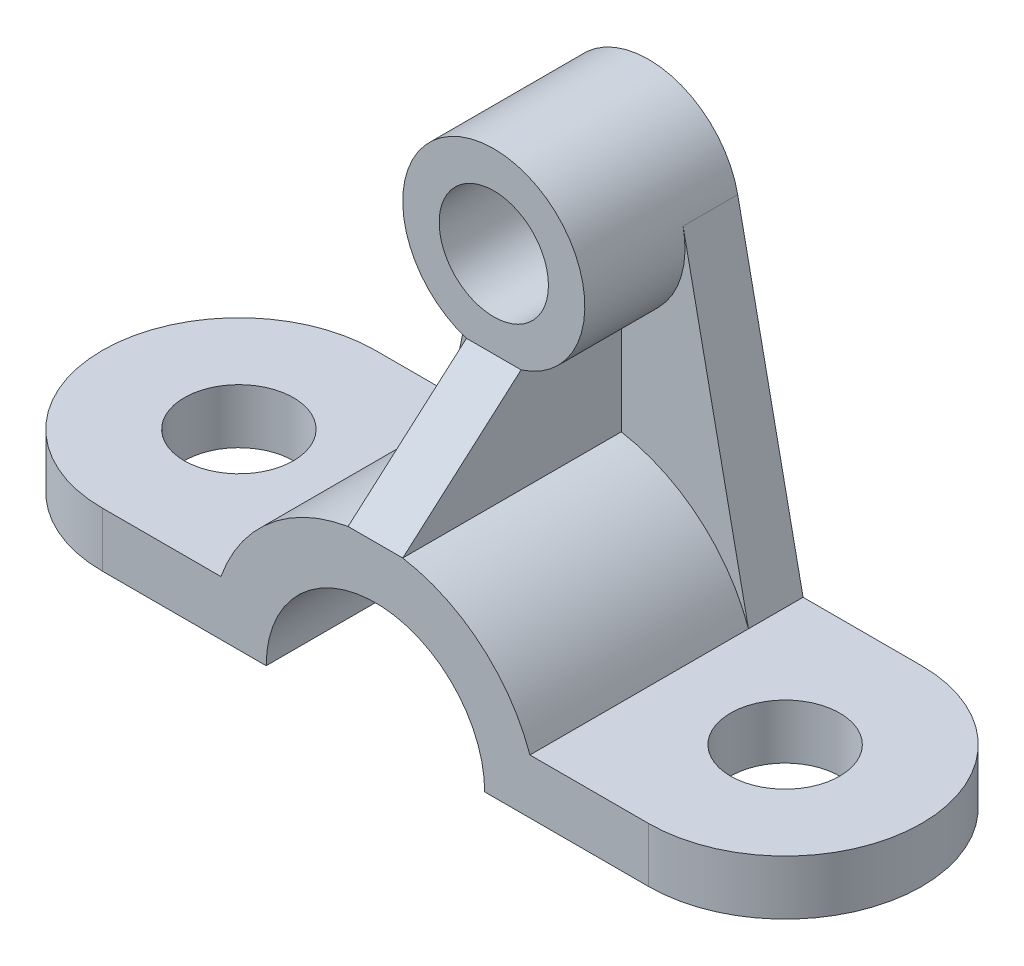
ISO-10303-21;
HEADER;
FILE_DESCRIPTION(('STEP AP214'),'2;1');
FILE_NAME('part.step','',(''),(''),'','','');
FILE_SCHEMA(('AUTOMOTIVE_DESIGN { 1 0 10303 214 1 1 1 1 }'));
ENDSEC;
DATA;
#1=APPLICATION_CONTEXT('core data for automotive mechanical design processes');
#2=APPLICATION_PROTOCOL_DEFINITION('international standard','automotive_design',2000,#1);
#3=PRODUCT_CONTEXT('',#1,'mechanical');
#4=PRODUCT('Part','Part','',(#3));
#5=PRODUCT_RELATED_PRODUCT_CATEGORY('part','',(#4));
#6=PRODUCT_DEFINITION_FORMATION('','',#4);
#7=PRODUCT_DEFINITION_CONTEXT('part definition',#1,'design');
#8=PRODUCT_DEFINITION('design','',#6,#7);
#9=PRODUCT_DEFINITION_SHAPE('','',#8);
#10=(LENGTH_UNIT() NAMED_UNIT(*) SI_UNIT(.MILLI.,.METRE.));
#11=(NAMED_UNIT(*) PLANE_ANGLE_UNIT() SI_UNIT($,.RADIAN.));
#12=(NAMED_UNIT(*) SI_UNIT($,.STERADIAN.) SOLID_ANGLE_UNIT());
#13=UNCERTAINTY_MEASURE_WITH_UNIT(LENGTH_MEASURE(1.E-05),#10,'distance_accuracy_value','');
#14=(GEOMETRIC_REPRESENTATION_CONTEXT(3) GLOBAL_UNCERTAINTY_ASSIGNED_CONTEXT((#13)) GLOBAL_UNIT_ASSIGNED_CONTEXT((#10,
#11,#12)) REPRESENTATION_CONTEXT('',''));
#15=CARTESIAN_POINT('',(0.,0.,0.));
#16=DIRECTION('',(0.,0.,1.));
#17=DIRECTION('',(1.,0.,0.));
#18=AXIS2_PLACEMENT_3D('',#15,#16,#17);
#19=CARTESIAN_POINT('',(-102.970359754415,18.3988084707033,60.));
#20=DIRECTION('',(0.,1.,0.));
#21=DIRECTION('',(-1.,0.,0.));
#22=AXIS2_PLACEMENT_3D('',#19,#20,#21);
#23=PLANE('',#22);
#24=CARTESIAN_POINT('',(-138.970359754415,18.3988084707033,30.));
#25=DIRECTION('',(0.,1.,0.));
#26=DIRECTION('',(0.,0.,1.));
#27=AXIS2_PLACEMENT_3D('',#24,#25,#26);
#28=CIRCLE('',#27,12.);
#29=CARTESIAN_POINT('',(-138.970359754415,18.3988084707033,42.));
#30=VERTEX_POINT('',#29);
#31=EDGE_CURVE('E286',#30,#30,#28,.T.);
#32=ORIENTED_EDGE('',*,*,#31,.T.);
#33=EDGE_LOOP('',(#32));
#34=FACE_BOUND('',#33,.T.);
#35=DIRECTION('',(1.,0.,0.));
#36=VECTOR('',#35,1.);
#37=CARTESIAN_POINT('',(-54.9703597544148,18.3988084707033,0.));
#38=LINE('',#37,#36);
#39=CARTESIAN_POINT('',(-138.970359754415,18.3988084707033,0.));
#40=VERTEX_POINT('',#39);
#41=CARTESIAN_POINT('',(-102.970359754415,18.3988084707033,0.));
#42=VERTEX_POINT('',#41);
#43=EDGE_CURVE('E185',#40,#42,#38,.T.);
#44=ORIENTED_EDGE('',*,*,#43,.T.);
#45=DIRECTION('',(0.,0.,-1.));
#46=VECTOR('',#45,1.);
#47=CARTESIAN_POINT('',(-102.970359754415,18.3988084707033,60.));
#48=LINE('',#47,#46);
#49=CARTESIAN_POINT('',(-102.970359754415,18.3988084707033,60.));
#50=VERTEX_POINT('',#49);
#51=EDGE_CURVE('E174',#50,#42,#48,.T.);
#52=ORIENTED_EDGE('',*,*,#51,.F.);
#53=DIRECTION('',(1.,0.,0.));
#54=VECTOR('',#53,1.);
#55=CARTESIAN_POINT('',(-102.970359754415,18.3988084707033,60.));
#56=LINE('',#55,#54);
#57=CARTESIAN_POINT('',(-138.970359754415,18.3988084707033,60.));
#58=VERTEX_POINT('',#57);
#59=EDGE_CURVE('E196',#58,#50,#56,.T.);
#60=ORIENTED_EDGE('',*,*,#59,.F.);
#61=CARTESIAN_POINT('',(-138.970359754415,18.3988084707033,30.));
#62=DIRECTION('',(0.,1.,0.));
#63=DIRECTION('',(-1.,0.,0.));
#64=AXIS2_PLACEMENT_3D('',#61,#62,#63);
#65=CIRCLE('',#64,30.);
#66=EDGE_CURVE('E222',#58,#40,#65,.F.);
#67=ORIENTED_EDGE('',*,*,#66,.T.);
#68=EDGE_LOOP('',(#44,#52,#60,#67));
#69=FACE_BOUND('',#68,.T.);
#70=ADVANCED_FACE('F48',(#34,#69),#23,.F.);
#71=CARTESIAN_POINT('',(-78.9703597544148,18.3988084707033,60.));
#72=DIRECTION('',(0.,0.,-1.));
#73=DIRECTION('',(-1.,0.,0.));
#74=AXIS2_PLACEMENT_3D('',#71,#72,#73);
#75=CYLINDRICAL_SURFACE('',#74,36.);
#76=DIRECTION('',(0.,0.,-1.));
#77=VECTOR('',#76,1.);
#78=CARTESIAN_POINT('',(-84.9703597544148,53.895287169301,60.));
#79=LINE('',#78,#77);
#80=CARTESIAN_POINT('',(-84.9703597544148,53.895287169301,12.));
#81=VERTEX_POINT('',#80);
#82=CARTESIAN_POINT('',(-84.9703597544148,53.895287169301,60.));
#83=VERTEX_POINT('',#82);
#84=EDGE_CURVE('E350',#81,#83,#79,.F.);
#85=ORIENTED_EDGE('',*,*,#84,.F.);
#86=CARTESIAN_POINT('',(-78.9703597544148,18.3988084707033,12.));
#87=DIRECTION('',(0.,0.,-1.));
#88=DIRECTION('',(-1.,0.,0.));
#89=AXIS2_PLACEMENT_3D('',#86,#87,#88);
#90=CIRCLE('',#89,36.);
#91=CARTESIAN_POINT('',(-112.911485251369,30.3988084707033,12.));
#92=VERTEX_POINT('',#91);
#93=EDGE_CURVE('E283',#92,#81,#90,.T.);
#94=ORIENTED_EDGE('',*,*,#93,.F.);
#95=DIRECTION('',(0.,0.,-1.));
#96=VECTOR('',#95,1.);
#97=CARTESIAN_POINT('',(-112.911485251369,30.3988084707033,60.));
#98=LINE('',#97,#96);
#99=CARTESIAN_POINT('',(-112.911485251369,30.3988084707033,60.));
#100=VERTEX_POINT('',#99);
#101=EDGE_CURVE('E208',#100,#92,#98,.T.);
#102=ORIENTED_EDGE('',*,*,#101,.F.);
#103=CARTESIAN_POINT('',(-78.9703597544148,18.3988084707033,60.));
#104=DIRECTION('',(0.,0.,1.));
#105=DIRECTION('',(1.,0.,0.));
#106=AXIS2_PLACEMENT_3D('',#103,#104,#105);
#107=CIRCLE('',#106,36.);
#108=EDGE_CURVE('E305',#83,#100,#107,.T.);
#109=ORIENTED_EDGE('',*,*,#108,.F.);
#110=EDGE_LOOP('',(#85,#94,#102,#109));
#111=FACE_BOUND('',#110,.T.);
#112=ADVANCED_FACE('F391',(#111),#75,.T.);
#113=DIRECTION('',(0.,0.,-1.));
#114=VECTOR('',#113,1.);
#115=CARTESIAN_POINT('',(-72.9703597544148,53.895287169301,60.));
#116=LINE('',#115,#114);
#117=CARTESIAN_POINT('',(-72.9703597544148,53.895287169301,60.));
#118=VERTEX_POINT('',#117);
#119=CARTESIAN_POINT('',(-72.9703597544148,53.895287169301,12.));
#120=VERTEX_POINT('',#119);
#121=EDGE_CURVE('E360',#118,#120,#116,.T.);
#122=ORIENTED_EDGE('',*,*,#121,.F.);
#123=CARTESIAN_POINT('',(-45.0292342574605,30.3988084707033,60.));
#124=VERTEX_POINT('',#123);
#125=EDGE_CURVE('E306',#124,#118,#107,.T.);
#126=ORIENTED_EDGE('',*,*,#125,.F.);
#127=DIRECTION('',(0.,0.,-1.));
#128=VECTOR('',#127,1.);
#129=CARTESIAN_POINT('',(-45.0292342574605,30.3988084707033,60.));
#130=LINE('',#129,#128);
#131=CARTESIAN_POINT('',(-45.0292342574605,30.3988084707033,12.));
#132=VERTEX_POINT('',#131);
#133=EDGE_CURVE('E168',#124,#132,#130,.T.);
#134=ORIENTED_EDGE('',*,*,#133,.T.);
#135=EDGE_CURVE('E261',#120,#132,#90,.T.);
#136=ORIENTED_EDGE('',*,*,#135,.F.);
#137=EDGE_LOOP('',(#122,#126,#134,#136));
#138=FACE_BOUND('',#137,.T.);
#139=ADVANCED_FACE('F402',(#138),#75,.T.);
#140=CARTESIAN_POINT('',(-78.9703597544148,95.7719290577585,12.));
#141=DIRECTION('',(0.,0.,-1.));
#142=DIRECTION('',(-1.,0.,0.));
#143=AXIS2_PLACEMENT_3D('',#140,#141,#142);
#144=CYLINDRICAL_SURFACE('',#143,20.);
#145=CARTESIAN_POINT('',(-78.9703597544148,95.7719290577585,12.));
#146=DIRECTION('',(0.,0.,-1.));
#147=DIRECTION('',(-1.,0.,0.));
#148=AXIS2_PLACEMENT_3D('',#145,#146,#147);
#149=CIRCLE('',#148,20.);
#150=CARTESIAN_POINT('',(-98.5560115632565,99.8218973567473,12.));
#151=VERTEX_POINT('',#150);
#152=CARTESIAN_POINT('',(-84.9703597544148,76.6931450294196,12.));
#153=VERTEX_POINT('',#152);
#154=EDGE_CURVE('E58',#151,#153,#149,.F.);
#155=ORIENTED_EDGE('',*,*,#154,.T.);
#156=DIRECTION('',(0.,0.,-1.));
#157=VECTOR('',#156,1.);
#158=CARTESIAN_POINT('',(-84.9703597544148,76.6931450294196,12.));
#159=LINE('',#158,#157);
#160=CARTESIAN_POINT('',(-84.9703597544148,76.6931450294196,34.));
#161=VERTEX_POINT('',#160);
#162=EDGE_CURVE('E357',#153,#161,#159,.F.);
#163=ORIENTED_EDGE('',*,*,#162,.T.);
#164=CARTESIAN_POINT('',(-78.9703597544148,95.7719290577585,34.));
#165=DIRECTION('',(0.,0.,1.));
#166=DIRECTION('',(1.,0.,0.));
#167=AXIS2_PLACEMENT_3D('',#164,#165,#166);
#168=CIRCLE('',#167,20.);
#169=CARTESIAN_POINT('',(-72.9703597544148,76.6931450294196,34.));
#170=VERTEX_POINT('',#169);
#171=EDGE_CURVE('E341',#170,#161,#168,.T.);
#172=ORIENTED_EDGE('',*,*,#171,.F.);
#173=DIRECTION('',(0.,0.,-1.));
#174=VECTOR('',#173,1.);
#175=CARTESIAN_POINT('',(-72.9703597544148,76.6931450294196,12.));
#176=LINE('',#175,#174);
#177=CARTESIAN_POINT('',(-72.9703597544148,76.6931450294196,12.));
#178=VERTEX_POINT('',#177);
#179=EDGE_CURVE('E254',#170,#178,#176,.T.);
#180=ORIENTED_EDGE('',*,*,#179,.T.);
#181=CARTESIAN_POINT('',(-59.384707945573,99.8218973567473,12.));
#182=VERTEX_POINT('',#181);
#183=EDGE_CURVE('E237',#178,#182,#149,.F.);
#184=ORIENTED_EDGE('',*,*,#183,.T.);
#185=DIRECTION('',(0.,0.,-1.));
#186=VECTOR('',#185,1.);
#187=CARTESIAN_POINT('',(-59.384707945573,99.8218973567473,12.));
#188=LINE('',#187,#186);
#189=CARTESIAN_POINT('',(-59.384707945573,99.8218973567473,0.));
#190=VERTEX_POINT('',#189);
#191=EDGE_CURVE('E250',#182,#190,#188,.T.);
#192=ORIENTED_EDGE('',*,*,#191,.T.);
#193=CARTESIAN_POINT('',(-78.9703597544148,95.7719290577585,0.));
#194=DIRECTION('',(0.,0.,-1.));
#195=DIRECTION('',(-1.,0.,0.));
#196=AXIS2_PLACEMENT_3D('',#193,#194,#195);
#197=CIRCLE('',#196,20.);
#198=CARTESIAN_POINT('',(-98.5560115632565,99.8218973567473,0.));
#199=VERTEX_POINT('',#198);
#200=EDGE_CURVE('E339',#199,#190,#197,.T.);
#201=ORIENTED_EDGE('',*,*,#200,.F.);
#202=DIRECTION('',(0.,0.,-1.));
#203=VECTOR('',#202,1.);
#204=CARTESIAN_POINT('',(-98.5560115632565,99.8218973567473,12.));
#205=LINE('',#204,#203);
#206=EDGE_CURVE('E331',#151,#199,#205,.T.);
#207=ORIENTED_EDGE('',*,*,#206,.F.);
#208=EDGE_LOOP('',(#155,#163,#172,#180,#184,#192,#201,#207));
#209=FACE_BOUND('',#208,.T.);
#210=ADVANCED_FACE('F247',(#209),#144,.T.);
#211=CARTESIAN_POINT('',(-78.9703597544148,95.7719290577585,12.));
#212=DIRECTION('',(0.,0.,-1.));
#213=DIRECTION('',(-1.,0.,0.));
#214=AXIS2_PLACEMENT_3D('',#211,#212,#213);
#215=PLANE('',#214);
#216=DIRECTION('',(0.,-1.,0.));
#217=VECTOR('',#216,1.);
#218=CARTESIAN_POINT('',(-84.9703597544148,79.2239690090847,12.));
#219=LINE('',#218,#217);
#220=EDGE_CURVE('E368',#153,#81,#219,.T.);
#221=ORIENTED_EDGE('',*,*,#220,.F.);
#222=ORIENTED_EDGE('',*,*,#154,.F.);
#223=DIRECTION('',(0.202498414949441,0.979282590442087,0.));
#224=VECTOR('',#223,1.);
#225=CARTESIAN_POINT('',(-98.5560115632565,99.8218973567473,12.));
#226=LINE('',#225,#224);
#227=EDGE_CURVE('E265',#92,#151,#226,.T.);
#228=ORIENTED_EDGE('',*,*,#227,.F.);
#229=ORIENTED_EDGE('',*,*,#93,.T.);
#230=EDGE_LOOP('',(#221,#222,#228,#229));
#231=FACE_BOUND('',#230,.T.);
#232=ADVANCED_FACE('F394',(#231),#215,.F.);
#233=DIRECTION('',(0.,1.,0.));
#234=VECTOR('',#233,1.);
#235=CARTESIAN_POINT('',(-72.9703597544148,79.2239690090847,12.));
#236=LINE('',#235,#234);
#237=EDGE_CURVE('E365',#120,#178,#236,.T.);
#238=ORIENTED_EDGE('',*,*,#237,.F.);
#239=ORIENTED_EDGE('',*,*,#135,.T.);
#240=DIRECTION('',(0.202498414949441,-0.979282590442087,0.));
#241=VECTOR('',#240,1.);
#242=CARTESIAN_POINT('',(-59.384707945573,99.8218973567473,12.));
#243=LINE('',#242,#241);
#244=EDGE_CURVE('E258',#182,#132,#243,.T.);
#245=ORIENTED_EDGE('',*,*,#244,.F.);
#246=ORIENTED_EDGE('',*,*,#183,.F.);
#247=EDGE_LOOP('',(#238,#239,#245,#246));
#248=FACE_BOUND('',#247,.T.);
#249=ADVANCED_FACE('F259',(#248),#215,.F.);
#250=CARTESIAN_POINT('',(-78.9703597544148,95.7719290577585,34.));
#251=DIRECTION('',(0.,0.,1.));
#252=DIRECTION('',(1.,0.,0.));
#253=AXIS2_PLACEMENT_3D('',#250,#251,#252);
#254=PLANE('',#253);
#255=ORIENTED_EDGE('',*,*,#171,.T.);
#256=DIRECTION('',(-1.,0.,0.));
#257=VECTOR('',#256,1.);
#258=CARTESIAN_POINT('',(11.0296402455852,76.6931450294196,34.));
#259=LINE('',#258,#257);
#260=EDGE_CURVE('E371',#170,#161,#259,.T.);
#261=ORIENTED_EDGE('',*,*,#260,.F.);
#262=EDGE_LOOP('',(#255,#261));
#263=FACE_BOUND('',#262,.T.);
#264=CARTESIAN_POINT('',(-78.9703597544148,95.7719290577585,34.));
#265=DIRECTION('',(0.,0.,1.));
#266=DIRECTION('',(1.,0.,0.));
#267=AXIS2_PLACEMENT_3D('',#264,#265,#266);
#268=CIRCLE('',#267,12.);
#269=CARTESIAN_POINT('',(-66.9703597544148,95.7719290577585,34.));
#270=VERTEX_POINT('',#269);
#271=EDGE_CURVE('E345',#270,#270,#268,.T.);
#272=ORIENTED_EDGE('',*,*,#271,.F.);
#273=EDGE_LOOP('',(#272));
#274=FACE_BOUND('',#273,.T.);
#275=ADVANCED_FACE('F406',(#263,#274),#254,.T.);
#276=CARTESIAN_POINT('',(-78.9703597544148,18.3988084707033,60.));
#277=DIRECTION('',(0.,0.,-1.));
#278=DIRECTION('',(-1.,0.,0.));
#279=AXIS2_PLACEMENT_3D('',#276,#277,#278);
#280=CYLINDRICAL_SURFACE('',#279,24.);
#281=ORIENTED_EDGE('',*,*,#51,.T.);
#282=CARTESIAN_POINT('',(-78.9703597544148,18.3988084707033,0.));
#283=DIRECTION('',(0.,0.,1.));
#284=DIRECTION('',(1.,0.,0.));
#285=AXIS2_PLACEMENT_3D('',#282,#283,#284);
#286=CIRCLE('',#285,24.);
#287=CARTESIAN_POINT('',(-54.9703597544148,18.3988084707033,0.));
#288=VERTEX_POINT('',#287);
#289=EDGE_CURVE('E171',#288,#42,#286,.T.);
#290=ORIENTED_EDGE('',*,*,#289,.F.);
#291=DIRECTION('',(0.,0.,-1.));
#292=VECTOR('',#291,1.);
#293=CARTESIAN_POINT('',(-54.9703597544148,18.3988084707033,60.));
#294=LINE('',#293,#292);
#295=CARTESIAN_POINT('',(-54.9703597544148,18.3988084707033,60.));
#296=VERTEX_POINT('',#295);
#297=EDGE_CURVE('E155',#296,#288,#294,.T.);
#298=ORIENTED_EDGE('',*,*,#297,.F.);
#299=CARTESIAN_POINT('',(-78.9703597544148,18.3988084707033,60.));
#300=DIRECTION('',(0.,0.,-1.));
#301=DIRECTION('',(1.,0.,0.));
#302=AXIS2_PLACEMENT_3D('',#299,#300,#301);
#303=CIRCLE('',#302,24.);
#304=EDGE_CURVE('E205',#50,#296,#303,.T.);
#305=ORIENTED_EDGE('',*,*,#304,.F.);
#306=EDGE_LOOP('',(#281,#290,#298,#305));
#307=FACE_BOUND('',#306,.T.);
#308=ADVANCED_FACE('F172',(#307),#280,.F.);
#309=CARTESIAN_POINT('',(-18.9703597544148,30.3988084707033,30.));
#310=DIRECTION('',(0.,1.,0.));
#311=DIRECTION('',(0.,0.,1.));
#312=AXIS2_PLACEMENT_3D('',#309,#310,#311);
#313=CYLINDRICAL_SURFACE('',#312,30.);
#314=DIRECTION('',(0.,1.,0.));
#315=VECTOR('',#314,1.);
#316=CARTESIAN_POINT('',(-18.9703597544148,18.3988084707033,0.));
#317=LINE('',#316,#315);
#318=CARTESIAN_POINT('',(-18.9703597544148,30.3988084707033,0.));
#319=VERTEX_POINT('',#318);
#320=CARTESIAN_POINT('',(-18.9703597544148,18.3988084707033,0.));
#321=VERTEX_POINT('',#320);
#322=EDGE_CURVE('E183',#319,#321,#317,.F.);
#323=ORIENTED_EDGE('',*,*,#322,.F.);
#324=CARTESIAN_POINT('',(-18.9703597544148,30.3988084707033,30.));
#325=DIRECTION('',(0.,-1.,0.));
#326=DIRECTION('',(1.,0.,0.));
#327=AXIS2_PLACEMENT_3D('',#324,#325,#326);
#328=CIRCLE('',#327,30.);
#329=CARTESIAN_POINT('',(-18.9703597544148,30.3988084707033,60.));
#330=VERTEX_POINT('',#329);
#331=EDGE_CURVE('E65',#330,#319,#328,.F.);
#332=ORIENTED_EDGE('',*,*,#331,.F.);
#333=DIRECTION('',(0.,-1.,0.));
#334=VECTOR('',#333,1.);
#335=CARTESIAN_POINT('',(-18.9703597544148,30.3988084707033,60.));
#336=LINE('',#335,#334);
#337=CARTESIAN_POINT('',(-18.9703597544148,18.3988084707033,60.));
#338=VERTEX_POINT('',#337);
#339=EDGE_CURVE('E231',#338,#330,#336,.F.);
#340=ORIENTED_EDGE('',*,*,#339,.F.);
#341=CARTESIAN_POINT('',(-18.9703597544148,18.3988084707033,30.));
#342=DIRECTION('',(0.,1.,0.));
#343=DIRECTION('',(-1.,0.,0.));
#344=AXIS2_PLACEMENT_3D('',#341,#342,#343);
#345=CIRCLE('',#344,30.);
#346=EDGE_CURVE('E73',#321,#338,#345,.F.);
#347=ORIENTED_EDGE('',*,*,#346,.F.);
#348=EDGE_LOOP('',(#323,#332,#340,#347));
#349=FACE_BOUND('',#348,.T.);
#350=ADVANCED_FACE('F51',(#349),#313,.T.);
#351=CARTESIAN_POINT('',(-138.970359754415,18.3988084707033,30.));
#352=DIRECTION('',(0.,-1.,0.));
#353=DIRECTION('',(0.,0.,-1.));
#354=AXIS2_PLACEMENT_3D('',#351,#352,#353);
#355=CYLINDRICAL_SURFACE('',#354,30.);
#356=DIRECTION('',(0.,-1.,0.));
#357=VECTOR('',#356,1.);
#358=CARTESIAN_POINT('',(-138.970359754415,18.3988084707033,0.));
#359=LINE('',#358,#357);
#360=CARTESIAN_POINT('',(-138.970359754415,30.3988084707033,0.));
#361=VERTEX_POINT('',#360);
#362=EDGE_CURVE('E167',#40,#361,#359,.F.);
#363=ORIENTED_EDGE('',*,*,#362,.F.);
#364=ORIENTED_EDGE('',*,*,#66,.F.);
#365=DIRECTION('',(0.,1.,0.));
#366=VECTOR('',#365,1.);
#367=CARTESIAN_POINT('',(-138.970359754415,18.3988084707033,60.));
#368=LINE('',#367,#366);
#369=CARTESIAN_POINT('',(-138.970359754415,30.3988084707033,60.));
#370=VERTEX_POINT('',#369);
#371=EDGE_CURVE('E218',#370,#58,#368,.F.);
#372=ORIENTED_EDGE('',*,*,#371,.F.);
#373=CARTESIAN_POINT('',(-138.970359754415,30.3988084707033,30.));
#374=DIRECTION('',(0.,-1.,0.));
#375=DIRECTION('',(0.,0.,-1.));
#376=AXIS2_PLACEMENT_3D('',#373,#374,#375);
#377=CIRCLE('',#376,30.);
#378=EDGE_CURVE('E226',#361,#370,#377,.F.);
#379=ORIENTED_EDGE('',*,*,#378,.F.);
#380=EDGE_LOOP('',(#363,#364,#372,#379));
#381=FACE_BOUND('',#380,.T.);
#382=ADVANCED_FACE('F451',(#381),#355,.T.);
#383=CARTESIAN_POINT('',(11.0296402455852,30.3988084707033,60.));
#384=DIRECTION('',(0.,-1.,0.));
#385=DIRECTION('',(1.,0.,0.));
#386=AXIS2_PLACEMENT_3D('',#383,#384,#385);
#387=PLANE('',#386);
#388=CARTESIAN_POINT('',(-18.9703597544148,30.3988084707033,30.));
#389=DIRECTION('',(0.,1.,0.));
#390=DIRECTION('',(0.,0.,1.));
#391=AXIS2_PLACEMENT_3D('',#388,#389,#390);
#392=CIRCLE('',#391,12.);
#393=CARTESIAN_POINT('',(-18.9703597544148,30.3988084707033,42.));
#394=VERTEX_POINT('',#393);
#395=EDGE_CURVE('E192',#394,#394,#392,.T.);
#396=ORIENTED_EDGE('',*,*,#395,.F.);
#397=EDGE_LOOP('',(#396));
#398=FACE_BOUND('',#397,.T.);
#399=DIRECTION('',(-1.,0.,0.));
#400=VECTOR('',#399,1.);
#401=CARTESIAN_POINT('',(11.0296402455852,30.3988084707033,60.));
#402=LINE('',#401,#400);
#403=EDGE_CURVE('E302',#330,#124,#402,.T.);
#404=ORIENTED_EDGE('',*,*,#403,.F.);
#405=ORIENTED_EDGE('',*,*,#331,.T.);
#406=DIRECTION('',(-1.,0.,0.));
#407=VECTOR('',#406,1.);
#408=CARTESIAN_POINT('',(11.0296402455852,30.3988084707033,0.));
#409=LINE('',#408,#407);
#410=CARTESIAN_POINT('',(-45.0292342574605,30.3988084707033,0.));
#411=VERTEX_POINT('',#410);
#412=EDGE_CURVE('E190',#319,#411,#409,.T.);
#413=ORIENTED_EDGE('',*,*,#412,.T.);
#414=DIRECTION('',(0.,0.,-1.));
#415=VECTOR('',#414,1.);
#416=CARTESIAN_POINT('',(-45.0292342574605,30.3988084707033,12.));
#417=LINE('',#416,#415);
#418=EDGE_CURVE('E273',#132,#411,#417,.T.);
#419=ORIENTED_EDGE('',*,*,#418,.F.);
#420=ORIENTED_EDGE('',*,*,#133,.F.);
#421=EDGE_LOOP('',(#404,#405,#413,#419,#420));
#422=FACE_BOUND('',#421,.T.);
#423=ADVANCED_FACE('F398',(#398,#422),#387,.F.);
#424=CARTESIAN_POINT('',(-168.970359754415,30.3988084707033,60.));
#425=DIRECTION('',(0.,-1.,0.));
#426=DIRECTION('',(0.,0.,-1.));
#427=AXIS2_PLACEMENT_3D('',#424,#425,#426);
#428=PLANE('',#427);
#429=CARTESIAN_POINT('',(-138.970359754415,30.3988084707033,30.));
#430=DIRECTION('',(0.,1.,0.));
#431=DIRECTION('',(0.,0.,1.));
#432=AXIS2_PLACEMENT_3D('',#429,#430,#431);
#433=CIRCLE('',#432,12.);
#434=CARTESIAN_POINT('',(-138.970359754415,30.3988084707033,42.));
#435=VERTEX_POINT('',#434);
#436=EDGE_CURVE('E291',#435,#435,#433,.T.);
#437=ORIENTED_EDGE('',*,*,#436,.F.);
#438=EDGE_LOOP('',(#437));
#439=FACE_BOUND('',#438,.T.);
#440=DIRECTION('',(-1.,0.,0.));
#441=VECTOR('',#440,1.);
#442=CARTESIAN_POINT('',(-168.970359754415,30.3988084707033,0.));
#443=LINE('',#442,#441);
#444=CARTESIAN_POINT('',(-112.911485251369,30.3988084707033,0.));
#445=VERTEX_POINT('',#444);
#446=EDGE_CURVE('E201',#445,#361,#443,.T.);
#447=ORIENTED_EDGE('',*,*,#446,.T.);
#448=ORIENTED_EDGE('',*,*,#378,.T.);
#449=DIRECTION('',(-1.,0.,0.));
#450=VECTOR('',#449,1.);
#451=CARTESIAN_POINT('',(-168.970359754415,30.3988084707033,60.));
#452=LINE('',#451,#450);
#453=EDGE_CURVE('E309',#100,#370,#452,.T.);
#454=ORIENTED_EDGE('',*,*,#453,.F.);
#455=ORIENTED_EDGE('',*,*,#101,.T.);
#456=DIRECTION('',(0.,0.,-1.));
#457=VECTOR('',#456,1.);
#458=CARTESIAN_POINT('',(-112.911485251369,30.3988084707033,12.));
#459=LINE('',#458,#457);
#460=EDGE_CURVE('E277',#92,#445,#459,.T.);
#461=ORIENTED_EDGE('',*,*,#460,.T.);
#462=EDGE_LOOP('',(#447,#448,#454,#455,#461));
#463=FACE_BOUND('',#462,.T.);
#464=ADVANCED_FACE('F326',(#439,#463),#428,.F.);
#465=ORIENTED_EDGE('',*,*,#297,.T.);
#466=EDGE_CURVE('E160',#288,#321,#38,.T.);
#467=ORIENTED_EDGE('',*,*,#466,.T.);
#468=ORIENTED_EDGE('',*,*,#346,.T.);
#469=DIRECTION('',(1.,0.,0.));
#470=VECTOR('',#469,1.);
#471=CARTESIAN_POINT('',(-54.9703597544148,18.3988084707033,60.));
#472=LINE('',#471,#470);
#473=EDGE_CURVE('E162',#296,#338,#472,.T.);
#474=ORIENTED_EDGE('',*,*,#473,.F.);
#475=EDGE_LOOP('',(#465,#467,#468,#474));
#476=FACE_BOUND('',#475,.T.);
#477=CARTESIAN_POINT('',(-18.9703597544148,18.3988084707033,30.));
#478=DIRECTION('',(0.,1.,0.));
#479=DIRECTION('',(0.,0.,1.));
#480=AXIS2_PLACEMENT_3D('',#477,#478,#479);
#481=CIRCLE('',#480,12.);
#482=CARTESIAN_POINT('',(-18.9703597544148,18.3988084707033,42.));
#483=VERTEX_POINT('',#482);
#484=EDGE_CURVE('E186',#483,#483,#481,.T.);
#485=ORIENTED_EDGE('',*,*,#484,.T.);
#486=EDGE_LOOP('',(#485));
#487=FACE_BOUND('',#486,.T.);
#488=ADVANCED_FACE('F157',(#476,#487),#23,.F.);
#489=CARTESIAN_POINT('',(-78.9703597544148,18.3988084707033,60.));
#490=DIRECTION('',(0.,0.,1.));
#491=DIRECTION('',(1.,0.,0.));
#492=AXIS2_PLACEMENT_3D('',#489,#490,#491);
#493=PLANE('',#492);
#494=DIRECTION('',(-1.,0.,0.));
#495=VECTOR('',#494,1.);
#496=CARTESIAN_POINT('',(11.0296402455852,53.895287169301,60.));
#497=LINE('',#496,#495);
#498=EDGE_CURVE('E372',#118,#83,#497,.T.);
#499=ORIENTED_EDGE('',*,*,#498,.T.);
#500=ORIENTED_EDGE('',*,*,#108,.T.);
#501=ORIENTED_EDGE('',*,*,#453,.T.);
#502=ORIENTED_EDGE('',*,*,#371,.T.);
#503=ORIENTED_EDGE('',*,*,#59,.T.);
#504=ORIENTED_EDGE('',*,*,#304,.T.);
#505=ORIENTED_EDGE('',*,*,#473,.T.);
#506=ORIENTED_EDGE('',*,*,#339,.T.);
#507=ORIENTED_EDGE('',*,*,#403,.T.);
#508=ORIENTED_EDGE('',*,*,#125,.T.);
#509=EDGE_LOOP('',(#499,#500,#501,#502,#503,#504,#505,#506,#507,#508));
#510=FACE_BOUND('',#509,.T.);
#511=ADVANCED_FACE('F317',(#510),#493,.T.);
#512=CARTESIAN_POINT('',(-78.9703597544148,18.3988084707033,0.));
#513=DIRECTION('',(0.,0.,1.));
#514=DIRECTION('',(1.,0.,0.));
#515=AXIS2_PLACEMENT_3D('',#512,#513,#514);
#516=PLANE('',#515);
#517=ORIENTED_EDGE('',*,*,#466,.F.);
#518=ORIENTED_EDGE('',*,*,#289,.T.);
#519=ORIENTED_EDGE('',*,*,#43,.F.);
#520=ORIENTED_EDGE('',*,*,#362,.T.);
#521=ORIENTED_EDGE('',*,*,#446,.F.);
#522=DIRECTION('',(0.202498414949441,0.979282590442087,0.));
#523=VECTOR('',#522,1.);
#524=CARTESIAN_POINT('',(-98.5560115632565,99.8218973567473,0.));
#525=LINE('',#524,#523);
#526=EDGE_CURVE('E266',#445,#199,#525,.T.);
#527=ORIENTED_EDGE('',*,*,#526,.T.);
#528=ORIENTED_EDGE('',*,*,#200,.T.);
#529=DIRECTION('',(0.202498414949441,-0.979282590442087,0.));
#530=VECTOR('',#529,1.);
#531=CARTESIAN_POINT('',(-59.384707945573,99.8218973567473,0.));
#532=LINE('',#531,#530);
#533=EDGE_CURVE('E270',#190,#411,#532,.T.);
#534=ORIENTED_EDGE('',*,*,#533,.T.);
#535=ORIENTED_EDGE('',*,*,#412,.F.);
#536=ORIENTED_EDGE('',*,*,#322,.T.);
#537=EDGE_LOOP('',(#517,#518,#519,#520,#521,#527,#528,#534,#535,#536));
#538=FACE_BOUND('',#537,.T.);
#539=ADVANCED_FACE('F181',(#538),#516,.F.);
#540=CARTESIAN_POINT('',(-138.970359754415,18.3988084707033,30.));
#541=DIRECTION('',(0.,1.,0.));
#542=DIRECTION('',(0.,0.,1.));
#543=AXIS2_PLACEMENT_3D('',#540,#541,#542);
#544=CYLINDRICAL_SURFACE('',#543,12.);
#545=ORIENTED_EDGE('',*,*,#31,.F.);
#546=EDGE_LOOP('',(#545));
#547=FACE_BOUND('',#546,.T.);
#548=ORIENTED_EDGE('',*,*,#436,.T.);
#549=EDGE_LOOP('',(#548));
#550=FACE_BOUND('',#549,.T.);
#551=ADVANCED_FACE('F469',(#547,#550),#544,.F.);
#552=CARTESIAN_POINT('',(-18.9703597544148,18.3988084707033,30.));
#553=DIRECTION('',(0.,1.,0.));
#554=DIRECTION('',(0.,0.,1.));
#555=AXIS2_PLACEMENT_3D('',#552,#553,#554);
#556=CYLINDRICAL_SURFACE('',#555,12.);
#557=ORIENTED_EDGE('',*,*,#484,.F.);
#558=EDGE_LOOP('',(#557));
#559=FACE_BOUND('',#558,.T.);
#560=ORIENTED_EDGE('',*,*,#395,.T.);
#561=EDGE_LOOP('',(#560));
#562=FACE_BOUND('',#561,.T.);
#563=ADVANCED_FACE('F472',(#559,#562),#556,.F.);
#564=CARTESIAN_POINT('',(-59.384707945573,99.8218973567473,12.));
#565=DIRECTION('',(0.979282590442087,0.202498414949441,0.));
#566=DIRECTION('',(-0.202498414949441,0.979282590442087,0.));
#567=AXIS2_PLACEMENT_3D('',#564,#565,#566);
#568=PLANE('',#567);
#569=ORIENTED_EDGE('',*,*,#533,.F.);
#570=ORIENTED_EDGE('',*,*,#191,.F.);
#571=ORIENTED_EDGE('',*,*,#244,.T.);
#572=ORIENTED_EDGE('',*,*,#418,.T.);
#573=EDGE_LOOP('',(#569,#570,#571,#572));
#574=FACE_BOUND('',#573,.T.);
#575=ADVANCED_FACE('F268',(#574),#568,.T.);
#576=CARTESIAN_POINT('',(-98.5560115632565,99.8218973567473,12.));
#577=DIRECTION('',(-0.979282590442087,0.202498414949441,0.));
#578=DIRECTION('',(-0.202498414949441,-0.979282590442087,0.));
#579=AXIS2_PLACEMENT_3D('',#576,#577,#578);
#580=PLANE('',#579);
#581=ORIENTED_EDGE('',*,*,#526,.F.);
#582=ORIENTED_EDGE('',*,*,#460,.F.);
#583=ORIENTED_EDGE('',*,*,#227,.T.);
#584=ORIENTED_EDGE('',*,*,#206,.T.);
#585=EDGE_LOOP('',(#581,#582,#583,#584));
#586=FACE_BOUND('',#585,.T.);
#587=ADVANCED_FACE('F395',(#586),#580,.T.);
#588=CARTESIAN_POINT('',(-78.9703597544148,95.7719290577585,34.));
#589=DIRECTION('',(0.,0.,-1.));
#590=DIRECTION('',(-1.,0.,0.));
#591=AXIS2_PLACEMENT_3D('',#588,#589,#590);
#592=CYLINDRICAL_SURFACE('',#591,12.);
#593=ORIENTED_EDGE('',*,*,#271,.T.);
#594=EDGE_LOOP('',(#593));
#595=FACE_BOUND('',#594,.T.);
#596=CARTESIAN_POINT('',(-78.9703597544148,95.7719290577585,12.));
#597=DIRECTION('',(0.,0.,1.));
#598=DIRECTION('',(1.,0.,0.));
#599=AXIS2_PLACEMENT_3D('',#596,#597,#598);
#600=CIRCLE('',#599,12.);
#601=CARTESIAN_POINT('',(-66.9703597544148,95.7719290577585,12.));
#602=VERTEX_POINT('',#601);
#603=EDGE_CURVE('E346',#602,#602,#600,.T.);
#604=ORIENTED_EDGE('',*,*,#603,.F.);
#605=EDGE_LOOP('',(#604));
#606=FACE_BOUND('',#605,.T.);
#607=ADVANCED_FACE('F412',(#595,#606),#592,.F.);
#608=ORIENTED_EDGE('',*,*,#603,.T.);
#609=EDGE_LOOP('',(#608));
#610=FACE_BOUND('',#609,.T.);
#611=ADVANCED_FACE('F415',(#610),#215,.F.);
#612=CARTESIAN_POINT('',(-84.9703597544148,79.2239690090847,60.));
#613=DIRECTION('',(1.,0.,0.));
#614=DIRECTION('',(0.,0.,-1.));
#615=AXIS2_PLACEMENT_3D('',#612,#613,#614);
#616=PLANE('',#615);
#617=ORIENTED_EDGE('',*,*,#84,.T.);
#618=DIRECTION('',(0.,-0.659288106171,0.751890412933598));
#619=VECTOR('',#618,1.);
#620=CARTESIAN_POINT('',(-84.9703597544148,53.895287169301,60.));
#621=LINE('',#620,#619);
#622=EDGE_CURVE('E178',#161,#83,#621,.T.);
#623=ORIENTED_EDGE('',*,*,#622,.F.);
#624=ORIENTED_EDGE('',*,*,#162,.F.);
#625=ORIENTED_EDGE('',*,*,#220,.T.);
#626=EDGE_LOOP('',(#617,#623,#624,#625));
#627=FACE_BOUND('',#626,.T.);
#628=ADVANCED_FACE('F387',(#627),#616,.F.);
#629=CARTESIAN_POINT('',(-72.9703597544148,79.2239690090847,60.));
#630=DIRECTION('',(-1.,0.,0.));
#631=DIRECTION('',(0.,0.,1.));
#632=AXIS2_PLACEMENT_3D('',#629,#630,#631);
#633=PLANE('',#632);
#634=ORIENTED_EDGE('',*,*,#179,.F.);
#635=DIRECTION('',(0.,-0.659288106171,0.751890412933598));
#636=VECTOR('',#635,1.);
#637=CARTESIAN_POINT('',(-72.9703597544148,64.904672456471,47.4442581744857));
#638=LINE('',#637,#636);
#639=EDGE_CURVE('E12',#170,#118,#638,.T.);
#640=ORIENTED_EDGE('',*,*,#639,.T.);
#641=ORIENTED_EDGE('',*,*,#121,.T.);
#642=ORIENTED_EDGE('',*,*,#237,.T.);
#643=EDGE_LOOP('',(#634,#640,#641,#642));
#644=FACE_BOUND('',#643,.T.);
#645=ADVANCED_FACE('F404',(#644),#633,.F.);
#646=CARTESIAN_POINT('',(11.0296402455852,53.895287169301,60.));
#647=DIRECTION('',(0.,-0.751890412933598,-0.659288106171));
#648=DIRECTION('',(0.,0.659288106171,-0.751890412933598));
#649=AXIS2_PLACEMENT_3D('',#646,#647,#648);
#650=PLANE('',#649);
#651=ORIENTED_EDGE('',*,*,#260,.T.);
#652=ORIENTED_EDGE('',*,*,#622,.T.);
#653=ORIENTED_EDGE('',*,*,#498,.F.);
#654=ORIENTED_EDGE('',*,*,#639,.F.);
#655=EDGE_LOOP('',(#651,#652,#653,#654));
#656=FACE_BOUND('',#655,.T.);
#657=ADVANCED_FACE('F381',(#656),#650,.F.);
#658=CLOSED_SHELL('',(#70,#112,#139,#210,#232,#249,#275,#308,#350,#382,#423,#464,#488,#511,#539,
#551,#563,#575,#587,#607,#611,#628,#645,#657));
#659=MANIFOLD_SOLID_BREP('B2',#658);
#660=ADVANCED_BREP_SHAPE_REPRESENTATION('',(#18,#659),#14);
#661=SHAPE_DEFINITION_REPRESENTATION(#9,#660);
ENDSEC;
END-ISO-10303-21;
